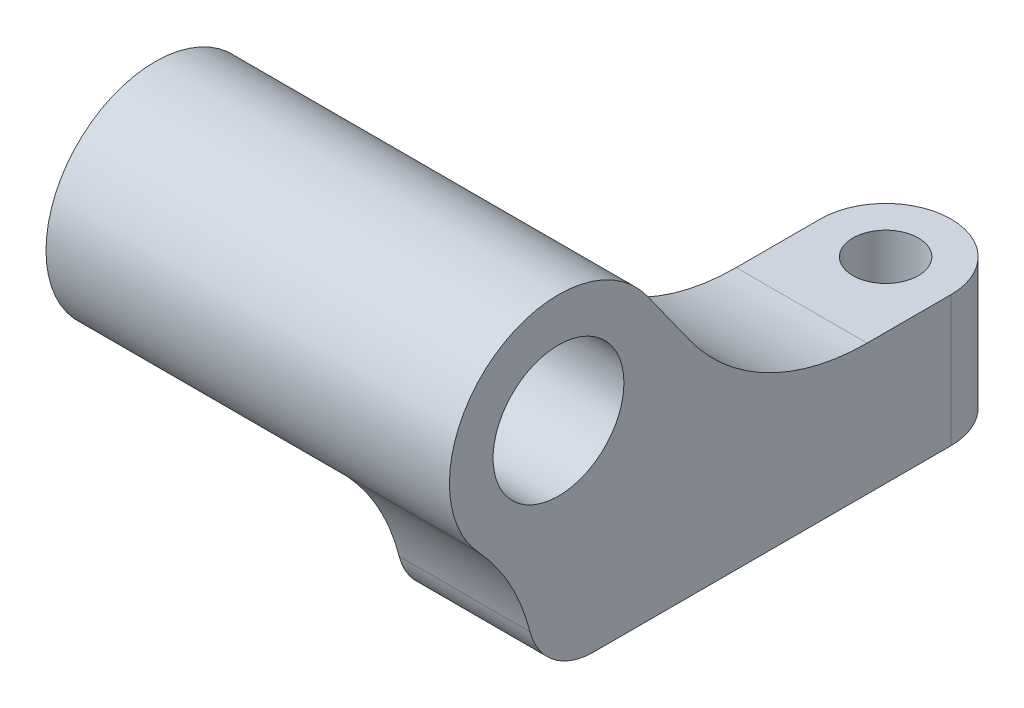
ISO-10303-21;
HEADER;
FILE_DESCRIPTION(('STEP AP214'),'2;1');
FILE_NAME('part.step','',(''),(''),'','','');
FILE_SCHEMA(('AUTOMOTIVE_DESIGN { 1 0 10303 214 1 1 1 1 }'));
ENDSEC;
DATA;
#1=APPLICATION_CONTEXT('core data for automotive mechanical design processes');
#2=APPLICATION_PROTOCOL_DEFINITION('international standard','automotive_design',2000,#1);
#3=PRODUCT_CONTEXT('',#1,'mechanical');
#4=PRODUCT('Part','Part','',(#3));
#5=PRODUCT_RELATED_PRODUCT_CATEGORY('part','',(#4));
#6=PRODUCT_DEFINITION_FORMATION('','',#4);
#7=PRODUCT_DEFINITION_CONTEXT('part definition',#1,'design');
#8=PRODUCT_DEFINITION('design','',#6,#7);
#9=PRODUCT_DEFINITION_SHAPE('','',#8);
#10=(LENGTH_UNIT() NAMED_UNIT(*) SI_UNIT(.MILLI.,.METRE.));
#11=(NAMED_UNIT(*) PLANE_ANGLE_UNIT() SI_UNIT($,.RADIAN.));
#12=(NAMED_UNIT(*) SI_UNIT($,.STERADIAN.) SOLID_ANGLE_UNIT());
#13=UNCERTAINTY_MEASURE_WITH_UNIT(LENGTH_MEASURE(1.E-05),#10,'distance_accuracy_value','');
#14=(GEOMETRIC_REPRESENTATION_CONTEXT(3) GLOBAL_UNCERTAINTY_ASSIGNED_CONTEXT((#13)) GLOBAL_UNIT_ASSIGNED_CONTEXT((#10,
#11,#12)) REPRESENTATION_CONTEXT('',''));
#15=CARTESIAN_POINT('',(0.,0.,0.));
#16=DIRECTION('',(0.,0.,1.));
#17=DIRECTION('',(1.,0.,0.));
#18=AXIS2_PLACEMENT_3D('',#15,#16,#17);
#19=CARTESIAN_POINT('',(6.,0.,0.));
#20=DIRECTION('',(-1.,0.,0.));
#21=DIRECTION('',(0.,0.,1.));
#22=AXIS2_PLACEMENT_3D('',#19,#20,#21);
#23=CYLINDRICAL_SURFACE('',#22,5.);
#24=DIRECTION('',(-1.,0.,0.));
#25=VECTOR('',#24,1.);
#26=CARTESIAN_POINT('',(6.,2.9055429055746,-4.06913018025538));
#27=LINE('',#26,#25);
#28=CARTESIAN_POINT('',(6.,2.9055429055746,-4.06913018025538));
#29=VERTEX_POINT('',#28);
#30=CARTESIAN_POINT('',(0.,2.9055429055746,-4.06913018025538));
#31=VERTEX_POINT('',#30);
#32=EDGE_CURVE('E150',#29,#31,#27,.T.);
#33=ORIENTED_EDGE('',*,*,#32,.T.);
#34=CARTESIAN_POINT('',(0.,0.,0.));
#35=DIRECTION('',(-1.,0.,0.));
#36=DIRECTION('',(0.,0.,1.));
#37=AXIS2_PLACEMENT_3D('',#34,#35,#36);
#38=CIRCLE('',#37,5.);
#39=CARTESIAN_POINT('',(0.,-3.40006680704247,3.66599859624196));
#40=VERTEX_POINT('',#39);
#41=EDGE_CURVE('E132',#31,#40,#38,.T.);
#42=ORIENTED_EDGE('',*,*,#41,.T.);
#43=DIRECTION('',(-1.,0.,0.));
#44=VECTOR('',#43,1.);
#45=CARTESIAN_POINT('',(6.,-3.40006680704247,3.66599859624196));
#46=LINE('',#45,#44);
#47=CARTESIAN_POINT('',(6.,-3.40006680704247,3.66599859624196));
#48=VERTEX_POINT('',#47);
#49=EDGE_CURVE('E156',#40,#48,#46,.F.);
#50=ORIENTED_EDGE('',*,*,#49,.T.);
#51=CARTESIAN_POINT('',(6.,0.,0.));
#52=DIRECTION('',(1.,0.,0.));
#53=DIRECTION('',(0.,0.,1.));
#54=AXIS2_PLACEMENT_3D('',#51,#52,#53);
#55=CIRCLE('',#54,5.);
#56=EDGE_CURVE('E140',#29,#48,#55,.T.);
#57=ORIENTED_EDGE('',*,*,#56,.F.);
#58=EDGE_LOOP('',(#33,#42,#50,#57));
#59=FACE_BOUND('',#58,.T.);
#60=CARTESIAN_POINT('',(-12.5,0.,0.));
#61=DIRECTION('',(-1.,0.,0.));
#62=DIRECTION('',(0.,0.,1.));
#63=AXIS2_PLACEMENT_3D('',#60,#61,#62);
#64=CIRCLE('',#63,5.);
#65=CARTESIAN_POINT('',(-12.5,0.,5.));
#66=VERTEX_POINT('',#65);
#67=EDGE_CURVE('E105',#66,#66,#64,.T.);
#68=ORIENTED_EDGE('',*,*,#67,.F.);
#69=EDGE_LOOP('',(#68));
#70=FACE_BOUND('',#69,.T.);
#71=ADVANCED_FACE('F32',(#59,#70),#23,.T.);
#72=CARTESIAN_POINT('',(6.,-10.,0.999999999999999));
#73=DIRECTION('',(0.,1.,0.));
#74=DIRECTION('',(0.,0.,1.));
#75=AXIS2_PLACEMENT_3D('',#72,#73,#74);
#76=PLANE('',#75);
#77=CARTESIAN_POINT('',(3.,-10.,-18.));
#78=DIRECTION('',(0.,1.,0.));
#79=DIRECTION('',(0.,0.,1.));
#80=AXIS2_PLACEMENT_3D('',#77,#78,#79);
#81=CIRCLE('',#80,1.5);
#82=CARTESIAN_POINT('',(3.,-10.,-16.5));
#83=VERTEX_POINT('',#82);
#84=EDGE_CURVE('E119',#83,#83,#81,.T.);
#85=ORIENTED_EDGE('',*,*,#84,.T.);
#86=EDGE_LOOP('',(#85));
#87=FACE_BOUND('',#86,.T.);
#88=DIRECTION('',(0.,0.,-1.));
#89=VECTOR('',#88,1.);
#90=CARTESIAN_POINT('',(6.,-10.,0.999999999999999));
#91=LINE('',#90,#89);
#92=CARTESIAN_POINT('',(6.,-10.,-1.60195330897352));
#93=VERTEX_POINT('',#92);
#94=CARTESIAN_POINT('',(6.,-10.,-18.));
#95=VERTEX_POINT('',#94);
#96=EDGE_CURVE('E143',#93,#95,#91,.T.);
#97=ORIENTED_EDGE('',*,*,#96,.F.);
#98=DIRECTION('',(1.,0.,0.));
#99=VECTOR('',#98,1.);
#100=CARTESIAN_POINT('',(6.,-10.,-1.60195330897352));
#101=LINE('',#100,#99);
#102=CARTESIAN_POINT('',(0.,-10.,-1.60195330897352));
#103=VERTEX_POINT('',#102);
#104=EDGE_CURVE('E103',#93,#103,#101,.F.);
#105=ORIENTED_EDGE('',*,*,#104,.T.);
#106=DIRECTION('',(0.,0.,-1.));
#107=VECTOR('',#106,1.);
#108=CARTESIAN_POINT('',(0.,-10.,0.999999999999999));
#109=LINE('',#108,#107);
#110=CARTESIAN_POINT('',(0.,-10.,-18.));
#111=VERTEX_POINT('',#110);
#112=EDGE_CURVE('E96',#103,#111,#109,.T.);
#113=ORIENTED_EDGE('',*,*,#112,.T.);
#114=CARTESIAN_POINT('',(3.,-10.,-18.));
#115=DIRECTION('',(0.,-1.,0.));
#116=DIRECTION('',(0.,0.,-1.));
#117=AXIS2_PLACEMENT_3D('',#114,#115,#116);
#118=CIRCLE('',#117,3.);
#119=EDGE_CURVE('E101',#111,#95,#118,.T.);
#120=ORIENTED_EDGE('',*,*,#119,.T.);
#121=EDGE_LOOP('',(#97,#105,#113,#120));
#122=FACE_BOUND('',#121,.T.);
#123=ADVANCED_FACE('F99',(#87,#122),#76,.F.);
#124=CARTESIAN_POINT('',(6.,-4.,-14.));
#125=DIRECTION('',(0.,-1.,0.));
#126=DIRECTION('',(0.,0.,-1.));
#127=AXIS2_PLACEMENT_3D('',#124,#125,#126);
#128=PLANE('',#127);
#129=CARTESIAN_POINT('',(3.,-4.,-18.));
#130=DIRECTION('',(0.,1.,0.));
#131=DIRECTION('',(0.,0.,1.));
#132=AXIS2_PLACEMENT_3D('',#129,#130,#131);
#133=CIRCLE('',#132,1.5);
#134=CARTESIAN_POINT('',(3.,-4.,-16.5));
#135=VERTEX_POINT('',#134);
#136=EDGE_CURVE('E122',#135,#135,#133,.T.);
#137=ORIENTED_EDGE('',*,*,#136,.F.);
#138=EDGE_LOOP('',(#137));
#139=FACE_BOUND('',#138,.T.);
#140=DIRECTION('',(0.,0.,1.));
#141=VECTOR('',#140,1.);
#142=CARTESIAN_POINT('',(0.,-4.,-14.));
#143=LINE('',#142,#141);
#144=CARTESIAN_POINT('',(0.,-4.,-18.));
#145=VERTEX_POINT('',#144);
#146=CARTESIAN_POINT('',(0.,-4.,-14.1471862576143));
#147=VERTEX_POINT('',#146);
#148=EDGE_CURVE('E104',#145,#147,#143,.T.);
#149=ORIENTED_EDGE('',*,*,#148,.T.);
#150=DIRECTION('',(-1.,0.,0.));
#151=VECTOR('',#150,1.);
#152=CARTESIAN_POINT('',(6.,-4.,-14.1471862576143));
#153=LINE('',#152,#151);
#154=CARTESIAN_POINT('',(6.,-4.,-14.1471862576143));
#155=VERTEX_POINT('',#154);
#156=EDGE_CURVE('E165',#147,#155,#153,.F.);
#157=ORIENTED_EDGE('',*,*,#156,.T.);
#158=DIRECTION('',(0.,0.,1.));
#159=VECTOR('',#158,1.);
#160=CARTESIAN_POINT('',(6.,-4.,-14.));
#161=LINE('',#160,#159);
#162=CARTESIAN_POINT('',(6.,-4.,-18.));
#163=VERTEX_POINT('',#162);
#164=EDGE_CURVE('E146',#163,#155,#161,.T.);
#165=ORIENTED_EDGE('',*,*,#164,.F.);
#166=CARTESIAN_POINT('',(3.,-4.,-18.));
#167=DIRECTION('',(0.,-1.,0.));
#168=DIRECTION('',(0.,0.,-1.));
#169=AXIS2_PLACEMENT_3D('',#166,#167,#168);
#170=CIRCLE('',#169,3.);
#171=EDGE_CURVE('E126',#163,#145,#170,.F.);
#172=ORIENTED_EDGE('',*,*,#171,.T.);
#173=EDGE_LOOP('',(#149,#157,#165,#172));
#174=FACE_BOUND('',#173,.T.);
#175=ADVANCED_FACE('F187',(#139,#174),#128,.F.);
#176=CARTESIAN_POINT('',(6.,-4.,-9.00000000000001));
#177=DIRECTION('',(0.,-0.581108581114919,0.813826036051075));
#178=DIRECTION('',(0.,-0.813826036051075,-0.581108581114919));
#179=AXIS2_PLACEMENT_3D('',#176,#177,#178);
#180=PLANE('',#179);
#181=DIRECTION('',(0.,0.813826036051075,0.581108581114919));
#182=VECTOR('',#181,1.);
#183=CARTESIAN_POINT('',(6.,-4.,-9.00000000000001));
#184=LINE('',#183,#182);
#185=CARTESIAN_POINT('',(6.,0.18891418885081,-6.00892589710355));
#186=VERTEX_POINT('',#185);
#187=EDGE_CURVE('E149',#186,#29,#184,.T.);
#188=ORIENTED_EDGE('',*,*,#187,.F.);
#189=DIRECTION('',(-1.,0.,0.));
#190=VECTOR('',#189,1.);
#191=CARTESIAN_POINT('',(0.,0.18891418885081,-6.00892589710355));
#192=LINE('',#191,#190);
#193=CARTESIAN_POINT('',(0.,0.18891418885081,-6.00892589710355));
#194=VERTEX_POINT('',#193);
#195=EDGE_CURVE('E162',#186,#194,#192,.T.);
#196=ORIENTED_EDGE('',*,*,#195,.T.);
#197=DIRECTION('',(0.,0.813826036051075,0.581108581114919));
#198=VECTOR('',#197,1.);
#199=CARTESIAN_POINT('',(0.,-4.,-9.00000000000001));
#200=LINE('',#199,#198);
#201=EDGE_CURVE('E144',#194,#31,#200,.T.);
#202=ORIENTED_EDGE('',*,*,#201,.T.);
#203=ORIENTED_EDGE('',*,*,#32,.F.);
#204=EDGE_LOOP('',(#188,#196,#202,#203));
#205=FACE_BOUND('',#204,.T.);
#206=ADVANCED_FACE('F181',(#205),#180,.F.);
#207=CARTESIAN_POINT('',(6.,0.,0.));
#208=DIRECTION('',(-1.,0.,0.));
#209=DIRECTION('',(0.,0.,1.));
#210=AXIS2_PLACEMENT_3D('',#207,#208,#209);
#211=PLANE('',#210);
#212=CARTESIAN_POINT('',(6.,0.,0.));
#213=DIRECTION('',(1.,0.,0.));
#214=DIRECTION('',(0.,0.,-1.));
#215=AXIS2_PLACEMENT_3D('',#212,#213,#214);
#216=CIRCLE('',#215,3.);
#217=CARTESIAN_POINT('',(6.,0.,-3.));
#218=VERTEX_POINT('',#217);
#219=EDGE_CURVE('E133',#218,#218,#216,.T.);
#220=ORIENTED_EDGE('',*,*,#219,.F.);
#221=EDGE_LOOP('',(#220));
#222=FACE_BOUND('',#221,.T.);
#223=CARTESIAN_POINT('',(6.,-10.2002004211274,10.9979957887259));
#224=DIRECTION('',(-1.,0.,0.));
#225=DIRECTION('',(0.,0.,1.));
#226=AXIS2_PLACEMENT_3D('',#223,#224,#225);
#227=CIRCLE('',#226,10.);
#228=CARTESIAN_POINT('',(6.,-7.73850778949094,1.30572725203403));
#229=VERTEX_POINT('',#228);
#230=EDGE_CURVE('E160',#48,#229,#227,.T.);
#231=ORIENTED_EDGE('',*,*,#230,.T.);
#232=CARTESIAN_POINT('',(6.,-7.,-1.60195330897352));
#233=DIRECTION('',(-1.,0.,0.));
#234=DIRECTION('',(0.,0.,1.));
#235=AXIS2_PLACEMENT_3D('',#232,#233,#234);
#236=CIRCLE('',#235,3.);
#237=EDGE_CURVE('E11',#229,#93,#236,.F.);
#238=ORIENTED_EDGE('',*,*,#237,.T.);
#239=ORIENTED_EDGE('',*,*,#96,.T.);
#240=DIRECTION('',(0.,-1.,0.));
#241=VECTOR('',#240,1.);
#242=CARTESIAN_POINT('',(6.,7.6619037896906,-18.));
#243=LINE('',#242,#241);
#244=EDGE_CURVE('E114',#163,#95,#243,.T.);
#245=ORIENTED_EDGE('',*,*,#244,.F.);
#246=ORIENTED_EDGE('',*,*,#164,.T.);
#247=CARTESIAN_POINT('',(6.,6.,-14.1471862576143));
#248=DIRECTION('',(-1.,0.,0.));
#249=DIRECTION('',(0.,0.,1.));
#250=AXIS2_PLACEMENT_3D('',#247,#248,#249);
#251=CIRCLE('',#250,10.);
#252=EDGE_CURVE('E169',#155,#186,#251,.T.);
#253=ORIENTED_EDGE('',*,*,#252,.T.);
#254=ORIENTED_EDGE('',*,*,#187,.T.);
#255=ORIENTED_EDGE('',*,*,#56,.T.);
#256=EDGE_LOOP('',(#231,#238,#239,#245,#246,#253,#254,#255));
#257=FACE_BOUND('',#256,.T.);
#258=ADVANCED_FACE('F175',(#222,#257),#211,.F.);
#259=CARTESIAN_POINT('',(0.,0.,0.));
#260=DIRECTION('',(-1.,0.,0.));
#261=DIRECTION('',(0.,0.,1.));
#262=AXIS2_PLACEMENT_3D('',#259,#260,#261);
#263=PLANE('',#262);
#264=ORIENTED_EDGE('',*,*,#112,.F.);
#265=CARTESIAN_POINT('',(0.,-7.,-1.60195330897352));
#266=DIRECTION('',(-1.,0.,0.));
#267=DIRECTION('',(0.,0.,1.));
#268=AXIS2_PLACEMENT_3D('',#265,#266,#267);
#269=CIRCLE('',#268,3.);
#270=CARTESIAN_POINT('',(0.,-7.73850778949094,1.30572725203403));
#271=VERTEX_POINT('',#270);
#272=EDGE_CURVE('E54',#103,#271,#269,.T.);
#273=ORIENTED_EDGE('',*,*,#272,.T.);
#274=CARTESIAN_POINT('',(0.,-10.2002004211274,10.9979957887259));
#275=DIRECTION('',(-1.,0.,0.));
#276=DIRECTION('',(0.,0.,1.));
#277=AXIS2_PLACEMENT_3D('',#274,#275,#276);
#278=CIRCLE('',#277,10.);
#279=EDGE_CURVE('E158',#271,#40,#278,.F.);
#280=ORIENTED_EDGE('',*,*,#279,.T.);
#281=ORIENTED_EDGE('',*,*,#41,.F.);
#282=ORIENTED_EDGE('',*,*,#201,.F.);
#283=CARTESIAN_POINT('',(0.,6.,-14.1471862576143));
#284=DIRECTION('',(-1.,0.,0.));
#285=DIRECTION('',(0.,0.,1.));
#286=AXIS2_PLACEMENT_3D('',#283,#284,#285);
#287=CIRCLE('',#286,10.);
#288=EDGE_CURVE('E167',#194,#147,#287,.F.);
#289=ORIENTED_EDGE('',*,*,#288,.T.);
#290=ORIENTED_EDGE('',*,*,#148,.F.);
#291=DIRECTION('',(0.,-1.,0.));
#292=VECTOR('',#291,1.);
#293=CARTESIAN_POINT('',(0.,7.6619037896906,-18.));
#294=LINE('',#293,#292);
#295=EDGE_CURVE('E108',#145,#111,#294,.T.);
#296=ORIENTED_EDGE('',*,*,#295,.T.);
#297=EDGE_LOOP('',(#264,#273,#280,#281,#282,#289,#290,#296));
#298=FACE_BOUND('',#297,.T.);
#299=ADVANCED_FACE('F109',(#298),#263,.T.);
#300=CARTESIAN_POINT('',(6.,-10.2002004211274,10.9979957887259));
#301=DIRECTION('',(1.,0.,0.));
#302=DIRECTION('',(0.,0.,-1.));
#303=AXIS2_PLACEMENT_3D('',#300,#301,#302);
#304=CYLINDRICAL_SURFACE('',#303,10.);
#305=ORIENTED_EDGE('',*,*,#279,.F.);
#306=DIRECTION('',(1.,0.,0.));
#307=VECTOR('',#306,1.);
#308=CARTESIAN_POINT('',(6.,-7.73850778949094,1.30572725203403));
#309=LINE('',#308,#307);
#310=EDGE_CURVE('E40',#271,#229,#309,.T.);
#311=ORIENTED_EDGE('',*,*,#310,.T.);
#312=ORIENTED_EDGE('',*,*,#230,.F.);
#313=ORIENTED_EDGE('',*,*,#49,.F.);
#314=EDGE_LOOP('',(#305,#311,#312,#313));
#315=FACE_BOUND('',#314,.T.);
#316=ADVANCED_FACE('F208',(#315),#304,.F.);
#317=CARTESIAN_POINT('',(-12.5,0.,0.));
#318=DIRECTION('',(-1.,0.,0.));
#319=DIRECTION('',(0.,0.,1.));
#320=AXIS2_PLACEMENT_3D('',#317,#318,#319);
#321=PLANE('',#320);
#322=CARTESIAN_POINT('',(-12.5,0.,0.));
#323=DIRECTION('',(1.,0.,0.));
#324=DIRECTION('',(0.,0.,-1.));
#325=AXIS2_PLACEMENT_3D('',#322,#323,#324);
#326=CIRCLE('',#325,3.);
#327=CARTESIAN_POINT('',(-12.5,0.,-3.));
#328=VERTEX_POINT('',#327);
#329=EDGE_CURVE('E129',#328,#328,#326,.T.);
#330=ORIENTED_EDGE('',*,*,#329,.T.);
#331=EDGE_LOOP('',(#330));
#332=FACE_BOUND('',#331,.T.);
#333=ORIENTED_EDGE('',*,*,#67,.T.);
#334=EDGE_LOOP('',(#333));
#335=FACE_BOUND('',#334,.T.);
#336=ADVANCED_FACE('F210',(#332,#335),#321,.T.);
#337=CARTESIAN_POINT('',(-12.5,0.,0.));
#338=DIRECTION('',(1.,0.,0.));
#339=DIRECTION('',(0.,0.,-1.));
#340=AXIS2_PLACEMENT_3D('',#337,#338,#339);
#341=CYLINDRICAL_SURFACE('',#340,3.);
#342=ORIENTED_EDGE('',*,*,#329,.F.);
#343=EDGE_LOOP('',(#342));
#344=FACE_BOUND('',#343,.T.);
#345=ORIENTED_EDGE('',*,*,#219,.T.);
#346=EDGE_LOOP('',(#345));
#347=FACE_BOUND('',#346,.T.);
#348=ADVANCED_FACE('F215',(#344,#347),#341,.F.);
#349=CARTESIAN_POINT('',(3.,7.6619037896906,-18.));
#350=DIRECTION('',(0.,-1.,0.));
#351=DIRECTION('',(0.,0.,-1.));
#352=AXIS2_PLACEMENT_3D('',#349,#350,#351);
#353=CYLINDRICAL_SURFACE('',#352,3.);
#354=ORIENTED_EDGE('',*,*,#171,.F.);
#355=ORIENTED_EDGE('',*,*,#244,.T.);
#356=ORIENTED_EDGE('',*,*,#119,.F.);
#357=ORIENTED_EDGE('',*,*,#295,.F.);
#358=EDGE_LOOP('',(#354,#355,#356,#357));
#359=FACE_BOUND('',#358,.T.);
#360=ADVANCED_FACE('F117',(#359),#353,.T.);
#361=CARTESIAN_POINT('',(6.,6.,-14.1471862576143));
#362=DIRECTION('',(1.,0.,0.));
#363=DIRECTION('',(0.,0.,-1.));
#364=AXIS2_PLACEMENT_3D('',#361,#362,#363);
#365=CYLINDRICAL_SURFACE('',#364,10.);
#366=ORIENTED_EDGE('',*,*,#252,.F.);
#367=ORIENTED_EDGE('',*,*,#156,.F.);
#368=ORIENTED_EDGE('',*,*,#288,.F.);
#369=ORIENTED_EDGE('',*,*,#195,.F.);
#370=EDGE_LOOP('',(#366,#367,#368,#369));
#371=FACE_BOUND('',#370,.T.);
#372=ADVANCED_FACE('F184',(#371),#365,.F.);
#373=CARTESIAN_POINT('',(3.,-10.,-18.));
#374=DIRECTION('',(0.,1.,0.));
#375=DIRECTION('',(0.,0.,1.));
#376=AXIS2_PLACEMENT_3D('',#373,#374,#375);
#377=CYLINDRICAL_SURFACE('',#376,1.5);
#378=ORIENTED_EDGE('',*,*,#84,.F.);
#379=EDGE_LOOP('',(#378));
#380=FACE_BOUND('',#379,.T.);
#381=ORIENTED_EDGE('',*,*,#136,.T.);
#382=EDGE_LOOP('',(#381));
#383=FACE_BOUND('',#382,.T.);
#384=ADVANCED_FACE('F191',(#380,#383),#377,.F.);
#385=CARTESIAN_POINT('',(6.,-7.,-1.60195330897352));
#386=DIRECTION('',(1.,0.,0.));
#387=DIRECTION('',(0.,0.,-1.));
#388=AXIS2_PLACEMENT_3D('',#385,#386,#387);
#389=CYLINDRICAL_SURFACE('',#388,3.);
#390=ORIENTED_EDGE('',*,*,#237,.F.);
#391=ORIENTED_EDGE('',*,*,#310,.F.);
#392=ORIENTED_EDGE('',*,*,#272,.F.);
#393=ORIENTED_EDGE('',*,*,#104,.F.);
#394=EDGE_LOOP('',(#390,#391,#392,#393));
#395=FACE_BOUND('',#394,.T.);
#396=ADVANCED_FACE('F34',(#395),#389,.T.);
#397=CLOSED_SHELL('',(#71,#123,#175,#206,#258,#299,#316,#336,#348,#360,#372,#384,#396));
#398=MANIFOLD_SOLID_BREP('B2',#397);
#399=ADVANCED_BREP_SHAPE_REPRESENTATION('',(#18,#398),#14);
#400=SHAPE_DEFINITION_REPRESENTATION(#9,#399);
ENDSEC;
END-ISO-10303-21;
